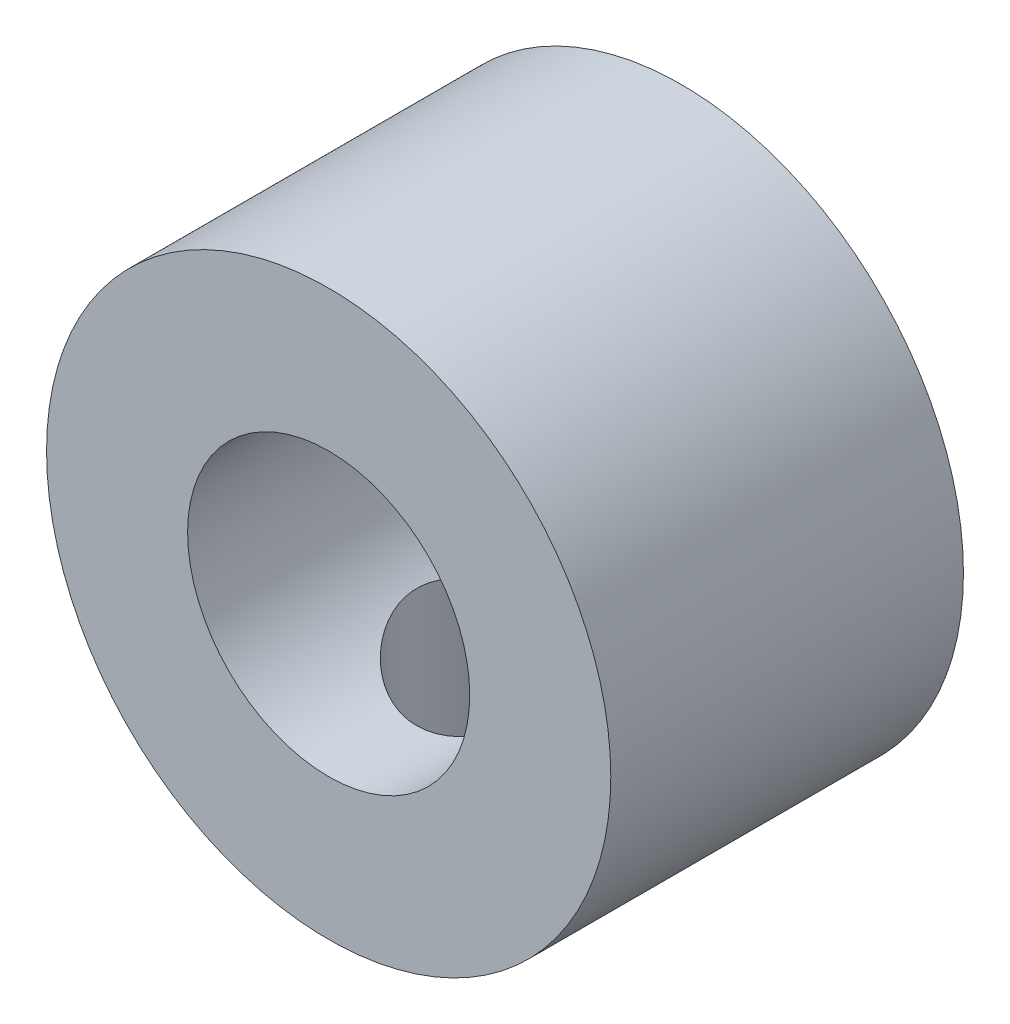
ISO-10303-21;
HEADER;
FILE_DESCRIPTION(('STEP AP214'),'2;1');
FILE_NAME('part.step','',(''),(''),'','','');
FILE_SCHEMA(('AUTOMOTIVE_DESIGN { 1 0 10303 214 1 1 1 1 }'));
ENDSEC;
DATA;
#1=APPLICATION_CONTEXT('core data for automotive mechanical design processes');
#2=APPLICATION_PROTOCOL_DEFINITION('international standard','automotive_design',2000,#1);
#3=PRODUCT_CONTEXT('',#1,'mechanical');
#4=PRODUCT('Part','Part','',(#3));
#5=PRODUCT_RELATED_PRODUCT_CATEGORY('part','',(#4));
#6=PRODUCT_DEFINITION_FORMATION('','',#4);
#7=PRODUCT_DEFINITION_CONTEXT('part definition',#1,'design');
#8=PRODUCT_DEFINITION('design','',#6,#7);
#9=PRODUCT_DEFINITION_SHAPE('','',#8);
#10=(LENGTH_UNIT() NAMED_UNIT(*) SI_UNIT(.MILLI.,.METRE.));
#11=(NAMED_UNIT(*) PLANE_ANGLE_UNIT() SI_UNIT($,.RADIAN.));
#12=(NAMED_UNIT(*) SI_UNIT($,.STERADIAN.) SOLID_ANGLE_UNIT());
#13=UNCERTAINTY_MEASURE_WITH_UNIT(LENGTH_MEASURE(1.E-05),#10,'distance_accuracy_value','');
#14=(GEOMETRIC_REPRESENTATION_CONTEXT(3) GLOBAL_UNCERTAINTY_ASSIGNED_CONTEXT((#13)) GLOBAL_UNIT_ASSIGNED_CONTEXT((#10,
#11,#12)) REPRESENTATION_CONTEXT('',''));
#15=CARTESIAN_POINT('',(0.,0.,0.));
#16=DIRECTION('',(0.,0.,1.));
#17=DIRECTION('',(1.,0.,0.));
#18=AXIS2_PLACEMENT_3D('',#15,#16,#17);
#19=CARTESIAN_POINT('',(0.,0.,6.));
#20=DIRECTION('',(0.,0.,1.));
#21=DIRECTION('',(1.,0.,0.));
#22=AXIS2_PLACEMENT_3D('',#19,#20,#21);
#23=PLANE('',#22);
#24=CARTESIAN_POINT('',(0.,0.,6.));
#25=DIRECTION('',(0.,0.,1.));
#26=DIRECTION('',(1.,0.,0.));
#27=AXIS2_PLACEMENT_3D('',#24,#25,#26);
#28=CIRCLE('',#27,4.8);
#29=CARTESIAN_POINT('',(4.8,0.,6.));
#30=VERTEX_POINT('',#29);
#31=EDGE_CURVE('E10',#30,#30,#28,.T.);
#32=ORIENTED_EDGE('',*,*,#31,.T.);
#33=EDGE_LOOP('',(#32));
#34=FACE_BOUND('',#33,.T.);
#35=CARTESIAN_POINT('',(0.,0.,6.));
#36=DIRECTION('',(0.,0.,1.));
#37=DIRECTION('',(1.,0.,0.));
#38=AXIS2_PLACEMENT_3D('',#35,#36,#37);
#39=CIRCLE('',#38,2.4);
#40=CARTESIAN_POINT('',(2.4,0.,6.));
#41=VERTEX_POINT('',#40);
#42=EDGE_CURVE('E58',#41,#41,#39,.T.);
#43=ORIENTED_EDGE('',*,*,#42,.F.);
#44=EDGE_LOOP('',(#43));
#45=FACE_BOUND('',#44,.T.);
#46=ADVANCED_FACE('F37',(#34,#45),#23,.T.);
#47=CARTESIAN_POINT('',(0.,0.,0.));
#48=DIRECTION('',(0.,0.,1.));
#49=DIRECTION('',(1.,0.,0.));
#50=AXIS2_PLACEMENT_3D('',#47,#48,#49);
#51=PLANE('',#50);
#52=CARTESIAN_POINT('',(0.,0.,0.));
#53=DIRECTION('',(0.,0.,1.));
#54=DIRECTION('',(1.,0.,0.));
#55=AXIS2_PLACEMENT_3D('',#52,#53,#54);
#56=CIRCLE('',#55,4.8);
#57=CARTESIAN_POINT('',(4.8,0.,0.));
#58=VERTEX_POINT('',#57);
#59=EDGE_CURVE('E52',#58,#58,#56,.T.);
#60=ORIENTED_EDGE('',*,*,#59,.F.);
#61=EDGE_LOOP('',(#60));
#62=FACE_BOUND('',#61,.T.);
#63=CARTESIAN_POINT('',(0.,0.,0.));
#64=DIRECTION('',(0.,0.,1.));
#65=DIRECTION('',(1.,0.,0.));
#66=AXIS2_PLACEMENT_3D('',#63,#64,#65);
#67=CIRCLE('',#66,2.4);
#68=CARTESIAN_POINT('',(2.4,0.,0.));
#69=VERTEX_POINT('',#68);
#70=EDGE_CURVE('E60',#69,#69,#67,.T.);
#71=ORIENTED_EDGE('',*,*,#70,.T.);
#72=EDGE_LOOP('',(#71));
#73=FACE_BOUND('',#72,.T.);
#74=ADVANCED_FACE('F84',(#62,#73),#51,.F.);
#75=CARTESIAN_POINT('',(0.,0.,6.));
#76=DIRECTION('',(0.,0.,-1.));
#77=DIRECTION('',(-1.,0.,0.));
#78=AXIS2_PLACEMENT_3D('',#75,#76,#77);
#79=CYLINDRICAL_SURFACE('',#78,4.8);
#80=CARTESIAN_POINT('',(0.,-4.8,4.5));
#81=CARTESIAN_POINT('',(0.0821270222094557,-4.79999959053588,4.49999946409491));
#82=CARTESIAN_POINT('',(0.164259663003431,-4.79787233981809,4.49323292766666));
#83=CARTESIAN_POINT('',(0.326123051506138,-4.78959472906568,4.46641651015292));
#84=CARTESIAN_POINT('',(0.405853251271089,-4.78344345839831,4.44636362236277));
#85=CARTESIAN_POINT('',(0.560554252380968,-4.76778978837491,4.39371675456511));
#86=CARTESIAN_POINT('',(0.635532212382964,-4.7582925779883,4.36114218641644));
#87=CARTESIAN_POINT('',(0.778961762815752,-4.73692762993311,4.28445921878601));
#88=CARTESIAN_POINT('',(0.847412322533862,-4.72505951879886,4.2403490018633));
#89=CARTESIAN_POINT('',(0.977958401942737,-4.69980256488339,4.14041280957917));
#90=CARTESIAN_POINT('',(1.03982403378799,-4.68638059112387,4.08429493792671));
#91=CARTESIAN_POINT('',(1.15343685844439,-4.6597205564905,3.96255792910374));
#92=CARTESIAN_POINT('',(1.20518216747844,-4.64648253028149,3.89693702700654));
#93=CARTESIAN_POINT('',(1.29833203779736,-4.62133373637806,3.7560665234303));
#94=CARTESIAN_POINT('',(1.33944940980155,-4.60946385962155,3.68061902696733));
#95=CARTESIAN_POINT('',(1.40831689292006,-4.58889362159081,3.52344922202175));
#96=CARTESIAN_POINT('',(1.43607052526334,-4.58019242554426,3.44172857304728));
#97=CARTESIAN_POINT('',(1.4765815191604,-4.56729128381401,3.27692630705752));
#98=CARTESIAN_POINT('',(1.48976532009438,-4.5629636751541,3.19395978763338));
#99=CARTESIAN_POINT('',(1.50209466044386,-4.5589206616914,3.02688825730573));
#100=CARTESIAN_POINT('',(1.50124393194926,-4.55920403072801,2.94278355501401));
#101=CARTESIAN_POINT('',(1.48586189679287,-4.56423826890525,2.77935064767722));
#102=CARTESIAN_POINT('',(1.47187269443259,-4.56881210095138,2.69996504896612));
#103=CARTESIAN_POINT('',(1.43148976026751,-4.58162430782987,2.54472941215518));
#104=CARTESIAN_POINT('',(1.40509471013461,-4.58986307211738,2.46887975074944));
#105=CARTESIAN_POINT('',(1.34026649617533,-4.60921252817156,2.32157766668084));
#106=CARTESIAN_POINT('',(1.30166310794498,-4.62036341592989,2.25020566716962));
#107=CARTESIAN_POINT('',(1.21363224885418,-4.64426227896084,2.11477467854505));
#108=CARTESIAN_POINT('',(1.16420196625893,-4.65701066873461,2.05071759569555));
#109=CARTESIAN_POINT('',(1.05326034501855,-4.68337833360592,1.92867006789961));
#110=CARTESIAN_POINT('',(0.991301484711381,-4.69701083526835,1.87108853066438));
#111=CARTESIAN_POINT('',(0.858437289714637,-4.72309884911496,1.76703372770438));
#112=CARTESIAN_POINT('',(0.787531292818824,-4.73555427406047,1.72056128493695));
#113=CARTESIAN_POINT('',(0.637997532558545,-4.75801553868229,1.63976677367847));
#114=CARTESIAN_POINT('',(0.559313888303135,-4.76800152777849,1.60554223744324));
#115=CARTESIAN_POINT('',(0.396921573339173,-4.78425546994265,1.55093639897812));
#116=CARTESIAN_POINT('',(0.31321443686953,-4.79052455190183,1.53055089331393));
#117=CARTESIAN_POINT('',(0.146622188748414,-4.79845667274016,1.50489834890522));
#118=CARTESIAN_POINT('',(0.0638302185466114,-4.80028827474524,1.49907774768777));
#119=CARTESIAN_POINT('',(-0.101556366879103,-4.7996375967718,1.5011594719648));
#120=CARTESIAN_POINT('',(-0.184151009167811,-4.79715594697362,1.50905979278713));
#121=CARTESIAN_POINT('',(-0.344663199571019,-4.78826836523714,1.53791471112766));
#122=CARTESIAN_POINT('',(-0.422645974105124,-4.78196151732824,1.55853992113498));
#123=CARTESIAN_POINT('',(-0.574022314633652,-4.76616145655147,1.61185722284006));
#124=CARTESIAN_POINT('',(-0.64741531253887,-4.75666785017212,1.64455080483001));
#125=CARTESIAN_POINT('',(-0.789518888006626,-4.73518251311309,1.72196785985842));
#126=CARTESIAN_POINT('',(-0.858071687745349,-4.72313552181201,1.76696518499617));
#127=CARTESIAN_POINT('',(-0.986839021152311,-4.69792092004115,1.86738385214091));
#128=CARTESIAN_POINT('',(-1.04705128565274,-4.68475300617465,1.92280802129357));
#129=CARTESIAN_POINT('',(-1.15990495550282,-4.6581239385977,2.04511066806252));
#130=CARTESIAN_POINT('',(-1.21215182807437,-4.64467184047729,2.11235599648707));
#131=CARTESIAN_POINT('',(-1.30465500294182,-4.61954336514727,2.25495193965213));
#132=CARTESIAN_POINT('',(-1.34491149568116,-4.60786695973572,2.33030242563238));
#133=CARTESIAN_POINT('',(-1.41204100176651,-4.58774138797043,2.48681420744457));
#134=CARTESIAN_POINT('',(-1.43896583467215,-4.57927975628249,2.56795157932287));
#135=CARTESIAN_POINT('',(-1.47867473181708,-4.56661405013172,2.73392699189834));
#136=CARTESIAN_POINT('',(-1.49146417696793,-4.56240835561473,2.81876361161224));
#137=CARTESIAN_POINT('',(-1.50215287389751,-4.55889951256652,2.98560490509651));
#138=CARTESIAN_POINT('',(-1.50069935545963,-4.5593832552017,3.0675641446169));
#139=CARTESIAN_POINT('',(-1.48450581754601,-4.56468108451084,3.23000950193033));
#140=CARTESIAN_POINT('',(-1.46976641787015,-4.56949496917925,3.31049568826408));
#141=CARTESIAN_POINT('',(-1.42785275896341,-4.58276177020068,3.46655284751027));
#142=CARTESIAN_POINT('',(-1.4008637088721,-4.59116037828308,3.54217852931203));
#143=CARTESIAN_POINT('',(-1.33536272801999,-4.61063645105477,3.68788849624081));
#144=CARTESIAN_POINT('',(-1.29684845333084,-4.62171446057606,3.75797165049408));
#145=CARTESIAN_POINT('',(-1.20762810016192,-4.64584184440203,3.89357516452778));
#146=CARTESIAN_POINT('',(-1.15650400228959,-4.65895138707548,3.95880975540029));
#147=CARTESIAN_POINT('',(-1.04425079568576,-4.68538798585452,4.0799835937344));
#148=CARTESIAN_POINT('',(-0.983119010813267,-4.69871509927985,4.13592034678927));
#149=CARTESIAN_POINT('',(-0.850183995388015,-4.72460726342968,4.23873904603552));
#150=CARTESIAN_POINT('',(-0.77809748938486,-4.73713322076807,4.28526568373994));
#151=CARTESIAN_POINT('',(-0.62673496561638,-4.75952123156253,4.36547869816734));
#152=CARTESIAN_POINT('',(-0.547461789354538,-4.76938433178986,4.3991701225702));
#153=CARTESIAN_POINT('',(-0.390897162448774,-4.78464780880164,4.45030964113016));
#154=CARTESIAN_POINT('',(-0.314004404535056,-4.7903548896737,4.4688898407664));
#155=CARTESIAN_POINT('',(-0.158075874528298,-4.7980308040858,4.49373403196126));
#156=CARTESIAN_POINT('',(-0.07904053936761,-4.80000039407571,4.50000051576481));
#157=CARTESIAN_POINT('',(0.,-4.8,4.5));
#158=B_SPLINE_CURVE_WITH_KNOTS('',3,(#80,#81,#82,#83,#84,#85,#86,#87,#88,#89,#90,#91,#92,#93,
#94,#95,#96,#97,#98,#99,#100,#101,#102,#103,#104,#105,#106,#107,#108,#109,#110,#111,#112,#113,
#114,#115,#116,#117,#118,#119,#120,#121,#122,#123,#124,#125,#126,#127,#128,#129,#130,#131,#132,
#133,#134,#135,#136,#137,#138,#139,#140,#141,#142,#143,#144,#145,#146,#147,#148,#149,#150,#151,
#152,#153,#154,#155,#156,#157),.UNSPECIFIED.,.T.,.F.,(4,2,2,2,2,2,2,2,2,2,2,2,2,2,2,2,2,2,2,2,2,
2,2,2,2,2,2,2,2,2,2,2,2,2,2,2,2,2,4),(0.,0.246090539319012,0.49223678801888,0.738002975042924,
0.98380790587007,1.2364538663419,1.48914680917531,1.74808525496993,2.00695543535433,
2.25802980200652,2.50903740354166,2.75012300906603,2.99123423974876,3.23586771264654,
3.4805647921243,3.7364009673552,3.99225608895964,4.25010552827724,4.50787661393465,
4.75569082257885,5.00346882779235,5.24508752067447,5.486736060414,5.73427589686012,
5.98188294851111,6.23930134455768,6.49671565180455,6.75312138904027,7.00942948676808,
7.25414644179994,7.49885198112759,7.73997496087463,7.98114701207666,8.23175416819091,
8.48242844859466,8.74128801763152,9.00004568011062,9.23693563993307,9.47377764927115),.UNSPECIFIED.);
#159=CARTESIAN_POINT('',(0.,-4.8,4.5));
#160=VERTEX_POINT('',#159);
#161=EDGE_CURVE('E64',#160,#160,#158,.T.);
#162=ORIENTED_EDGE('',*,*,#161,.T.);
#163=EDGE_LOOP('',(#162));
#164=FACE_BOUND('',#163,.T.);
#165=ORIENTED_EDGE('',*,*,#31,.F.);
#166=EDGE_LOOP('',(#165));
#167=FACE_BOUND('',#166,.T.);
#168=ORIENTED_EDGE('',*,*,#59,.T.);
#169=EDGE_LOOP('',(#168));
#170=FACE_BOUND('',#169,.T.);
#171=ADVANCED_FACE('F39',(#164,#167,#170),#79,.T.);
#172=CARTESIAN_POINT('',(0.,0.,6.));
#173=DIRECTION('',(0.,0.,-1.));
#174=DIRECTION('',(-1.,0.,0.));
#175=AXIS2_PLACEMENT_3D('',#172,#173,#174);
#176=CYLINDRICAL_SURFACE('',#175,2.4);
#177=CARTESIAN_POINT('',(0.,-2.4,4.5));
#178=CARTESIAN_POINT('',(0.0762125676002432,-2.39999514366375,4.49999478000146));
#179=CARTESIAN_POINT('',(0.152515729264509,-2.39633187973201,4.49415238581863));
#180=CARTESIAN_POINT('',(0.302781914718339,-2.38202601268923,4.4710970358846));
#181=CARTESIAN_POINT('',(0.376740195958888,-2.37137010689875,4.45386240728942));
#182=CARTESIAN_POINT('',(0.519846669764139,-2.34415023578561,4.40902636420554));
#183=CARTESIAN_POINT('',(0.58901669239802,-2.32761552934395,4.38147625459094));
#184=CARTESIAN_POINT('',(0.721512442642032,-2.29001518183288,4.3171369790439));
#185=CARTESIAN_POINT('',(0.784838816731383,-2.26895004282325,4.28034883678897));
#186=CARTESIAN_POINT('',(0.909569030601568,-2.22204183482728,4.19533611217803));
#187=CARTESIAN_POINT('',(0.970415472923973,-2.1959515466954,4.14643284002946));
#188=CARTESIAN_POINT('',(1.08358365017611,-2.14237619896358,4.04013699059214));
#189=CARTESIAN_POINT('',(1.13589372865888,-2.11488929830263,3.98273300609047));
#190=CARTESIAN_POINT('',(1.23771447884559,-2.05716502386238,3.85195932695458));
#191=CARTESIAN_POINT('',(1.28588647234981,-2.02705933192095,3.77748025607127));
#192=CARTESIAN_POINT('',(1.36888759224047,-1.97196237754477,3.61972222146338));
#193=CARTESIAN_POINT('',(1.40373925079441,-1.94696251195486,3.53645842490871));
#194=CARTESIAN_POINT('',(1.45120080703177,-1.91171490752837,3.38542737146554));
#195=CARTESIAN_POINT('',(1.46723462845672,-1.89932287188088,3.31923981775342));
#196=CARTESIAN_POINT('',(1.49018212302576,-1.88137628790967,3.18443288926704));
#197=CARTESIAN_POINT('',(1.49710867610505,-1.87581208408431,3.11581709007062));
#198=CARTESIAN_POINT('',(1.50142701894864,-1.87235862939393,2.97790437989866));
#199=CARTESIAN_POINT('',(1.49879380473421,-1.87448950526062,2.90860615624512));
#200=CARTESIAN_POINT('',(1.48411580456165,-1.88612882860704,2.77162787617325));
#201=CARTESIAN_POINT('',(1.47206347518052,-1.89564318920532,2.7039491615531));
#202=CARTESIAN_POINT('',(1.43961724045769,-1.92039087746137,2.57347385681103));
#203=CARTESIAN_POINT('',(1.41942020084276,-1.93548858125777,2.51060105317888));
#204=CARTESIAN_POINT('',(1.37148227785125,-1.96974679732087,2.3890065811135));
#205=CARTESIAN_POINT('',(1.34373872632435,-1.98890874601624,2.33028639015061));
#206=CARTESIAN_POINT('',(1.27553871545939,-2.03345779191624,2.20700007140071));
#207=CARTESIAN_POINT('',(1.23367555921404,-2.05933909891151,2.14339102785553));
#208=CARTESIAN_POINT('',(1.14105775560252,-2.11206854149492,2.02340366519943));
#209=CARTESIAN_POINT('',(1.09029396961373,-2.13891764803171,1.96703288195218));
#210=CARTESIAN_POINT('',(0.971423655627999,-2.19575873900228,1.85363790075553));
#211=CARTESIAN_POINT('',(0.901837624314401,-2.22553838011912,1.7980404308894));
#212=CARTESIAN_POINT('',(0.752577719512284,-2.28033666074934,1.6993789249353));
#213=CARTESIAN_POINT('',(0.672907828658399,-2.30535717017717,1.65630996272529));
#214=CARTESIAN_POINT('',(0.509860275521699,-2.34664047553579,1.58668357394229));
#215=CARTESIAN_POINT('',(0.426916149278846,-2.36330371909889,1.55935915202258));
#216=CARTESIAN_POINT('',(0.256334585489972,-2.38781915172058,1.51948208642062));
#217=CARTESIAN_POINT('',(0.168703978009566,-2.39568381588084,1.5069085269336));
#218=CARTESIAN_POINT('',(0.00541874248870722,-2.40117408648109,1.49812097992656));
#219=CARTESIAN_POINT('',(-0.0700833289965409,-2.40014593614613,1.49975618645537));
#220=CARTESIAN_POINT('',(-0.21956654159557,-2.39110681793192,1.51425939410487));
#221=CARTESIAN_POINT('',(-0.293547785955279,-2.3830963256831,1.5271266301106));
#222=CARTESIAN_POINT('',(-0.435025284789826,-2.36128862739684,1.56268624403035));
#223=CARTESIAN_POINT('',(-0.502662011943844,-2.34773004632213,1.58497458815598));
#224=CARTESIAN_POINT('',(-0.633165937285185,-2.31594820925702,1.63835566713428));
#225=CARTESIAN_POINT('',(-0.696032334564857,-2.2977241722032,1.66944987630618));
#226=CARTESIAN_POINT('',(-0.822100867532707,-2.255880148272,1.74301824719458));
#227=CARTESIAN_POINT('',(-0.884696361412084,-2.23190117780669,1.78632428308588));
#228=CARTESIAN_POINT('',(-1.00217116826081,-2.1816836400206,1.88135263818337));
#229=CARTESIAN_POINT('',(-1.05704178155022,-2.15544257791661,1.93308430710544));
#230=CARTESIAN_POINT('',(-1.16576903762746,-2.0988704365571,2.05216204729518));
#231=CARTESIAN_POINT('',(-1.21832222327703,-2.06849860097949,2.12068464755374));
#232=CARTESIAN_POINT('',(-1.31136422262821,-2.01080115297806,2.26665094193311));
#233=CARTESIAN_POINT('',(-1.35186138862432,-1.98347343986803,2.34408840810359));
#234=CARTESIAN_POINT('',(-1.41221726414194,-1.9408023637751,2.48963057766825));
#235=CARTESIAN_POINT('',(-1.43462275038575,-1.92414763432536,2.55628890087866));
#236=CARTESIAN_POINT('',(-1.47000129846294,-1.89726036796521,2.6932717749227));
#237=CARTESIAN_POINT('',(-1.48298909979753,-1.88701779891127,2.76359041134175));
#238=CARTESIAN_POINT('',(-1.49881660384385,-1.87447589986478,2.90650833225682));
#239=CARTESIAN_POINT('',(-1.50159824355951,-1.87222202009483,2.97911830258581));
#240=CARTESIAN_POINT('',(-1.49663734460181,-1.87618875731817,3.12375715243924));
#241=CARTESIAN_POINT('',(-1.48889130780171,-1.88241219114703,3.19578583081142));
#242=CARTESIAN_POINT('',(-1.46445926884079,-1.90146466525601,3.33123575406163));
#243=CARTESIAN_POINT('',(-1.44854303399724,-1.91372169661272,3.39488316169969));
#244=CARTESIAN_POINT('',(-1.40901148163416,-1.94301036522828,3.51856207150309));
#245=CARTESIAN_POINT('',(-1.38539295359288,-1.96004399308473,3.578592053445));
#246=CARTESIAN_POINT('',(-1.32723228527542,-1.99996683463822,3.70271609264724));
#247=CARTESIAN_POINT('',(-1.29160373346552,-2.02334676598796,3.76614035817186));
#248=CARTESIAN_POINT('',(-1.21200020443668,-2.07201247694241,3.8867260406952));
#249=CARTESIAN_POINT('',(-1.16801847944033,-2.0972997873219,3.94388233507257));
#250=CARTESIAN_POINT('',(-1.06280426569928,-2.15282292877418,4.06201710597341));
#251=CARTESIAN_POINT('',(-0.999880409096158,-2.18304650170531,4.12150901453458));
#252=CARTESIAN_POINT('',(-0.86378693523025,-2.24038474868097,4.22939379564629));
#253=CARTESIAN_POINT('',(-0.790611018166264,-2.26749749237273,4.27777979511288));
#254=CARTESIAN_POINT('',(-0.635226479869694,-2.31584053171858,4.36172535614892));
#255=CARTESIAN_POINT('',(-0.55300287246789,-2.33706085626428,4.39726320648701));
#256=CARTESIAN_POINT('',(-0.382073655275404,-2.37097825965411,4.45328626119809));
#257=CARTESIAN_POINT('',(-0.293392201328224,-2.38370545714427,4.47382468184374));
#258=CARTESIAN_POINT('',(-0.1697021774696,-2.39423366601772,4.49075905099516));
#259=CARTESIAN_POINT('',(-0.135898330635446,-2.39639006671561,4.49421823840077));
#260=CARTESIAN_POINT('',(-0.0680690237845086,-2.39927436255887,4.49883994984512));
#261=CARTESIAN_POINT('',(-0.0340435501817437,-2.40000216928693,4.50000233173199));
#262=CARTESIAN_POINT('',(0.,-2.4,4.5));
#263=B_SPLINE_CURVE_WITH_KNOTS('',3,(#177,#178,#179,#180,#181,#182,#183,#184,#185,#186,#187,
#188,#189,#190,#191,#192,#193,#194,#195,#196,#197,#198,#199,#200,#201,#202,#203,#204,#205,#206,
#207,#208,#209,#210,#211,#212,#213,#214,#215,#216,#217,#218,#219,#220,#221,#222,#223,#224,#225,
#226,#227,#228,#229,#230,#231,#232,#233,#234,#235,#236,#237,#238,#239,#240,#241,#242,#243,#244,
#245,#246,#247,#248,#249,#250,#251,#252,#253,#254,#255,#256,#257,#258,#259,#260,#261,#262),
.UNSPECIFIED.,.T.,.F.,(4,2,2,2,2,2,2,2,2,2,2,2,2,2,2,2,2,2,2,2,2,2,2,2,2,2,2,2,2,2,2,2,2,2,2,2,
2,2,2,2,2,2,4),(0.,0.228494761720959,0.457425472954154,0.685232385114164,0.913014064846555,
1.15898624464346,1.40529153990842,1.68495571023568,1.96414469528413,2.1709441065566,
2.37745073648869,2.58449788198534,2.791711014061,2.99419007352524,3.1967408148964,
3.43712940425232,3.67776627090218,3.95810616839426,4.23833568873433,4.50341008963151,
4.76810817549757,4.99352616717087,5.21892880478737,5.43551405437558,5.6521355871416,
5.89062277188663,6.12937642593223,6.40278850636456,6.67601072636293,6.89195928376464,
7.10756912896023,7.32440369625841,7.54131033076637,7.74075802845289,7.94028896776131,
8.16870627644374,8.39730889384523,8.67120646842134,8.945273094942,9.21980070728493,
9.49334953133289,9.59541001478977,9.69747681468706),.UNSPECIFIED.);
#264=CARTESIAN_POINT('',(0.,-2.4,4.5));
#265=VERTEX_POINT('',#264);
#266=EDGE_CURVE('E42',#265,#265,#263,.T.);
#267=ORIENTED_EDGE('',*,*,#266,.F.);
#268=EDGE_LOOP('',(#267));
#269=FACE_BOUND('',#268,.T.);
#270=ORIENTED_EDGE('',*,*,#42,.T.);
#271=EDGE_LOOP('',(#270));
#272=FACE_BOUND('',#271,.T.);
#273=ORIENTED_EDGE('',*,*,#70,.F.);
#274=EDGE_LOOP('',(#273));
#275=FACE_BOUND('',#274,.T.);
#276=ADVANCED_FACE('F76',(#269,#272,#275),#176,.F.);
#277=CARTESIAN_POINT('',(0.,-6.,3.));
#278=DIRECTION('',(0.,1.,0.));
#279=DIRECTION('',(0.,0.,1.));
#280=AXIS2_PLACEMENT_3D('',#277,#278,#279);
#281=CYLINDRICAL_SURFACE('',#280,1.5);
#282=ORIENTED_EDGE('',*,*,#266,.T.);
#283=EDGE_LOOP('',(#282));
#284=FACE_BOUND('',#283,.T.);
#285=ORIENTED_EDGE('',*,*,#161,.F.);
#286=EDGE_LOOP('',(#285));
#287=FACE_BOUND('',#286,.T.);
#288=ADVANCED_FACE('F73',(#284,#287),#281,.F.);
#289=CLOSED_SHELL('',(#46,#74,#171,#276,#288));
#290=MANIFOLD_SOLID_BREP('B2',#289);
#291=ADVANCED_BREP_SHAPE_REPRESENTATION('',(#18,#290),#14);
#292=SHAPE_DEFINITION_REPRESENTATION(#9,#291);
ENDSEC;
END-ISO-10303-21;
